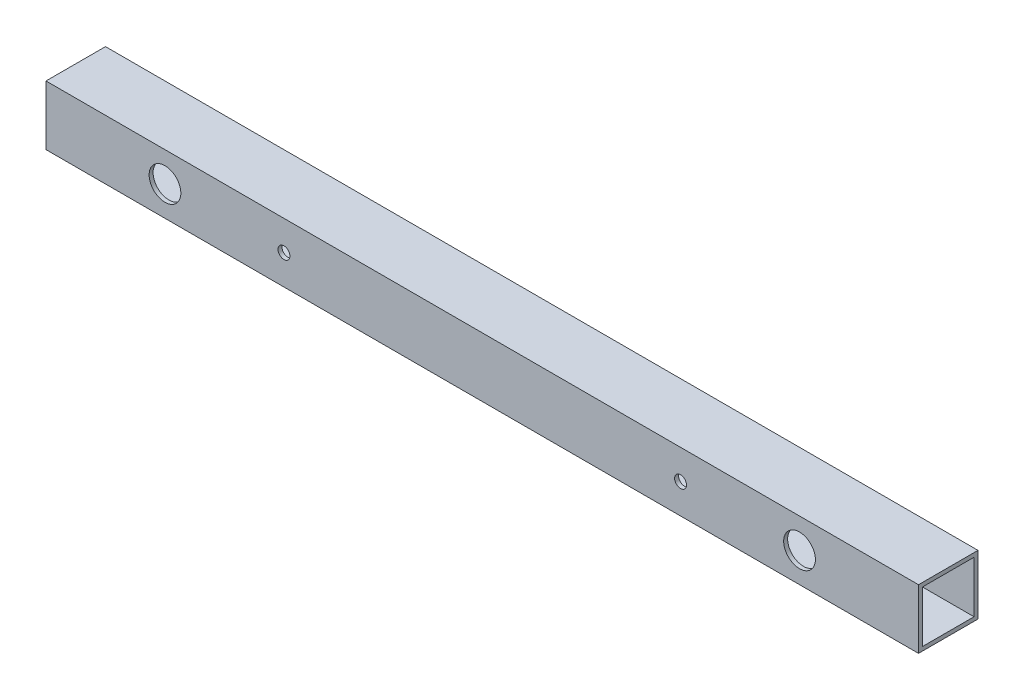
ISO-10303-21;
HEADER;
FILE_DESCRIPTION(('STEP AP214'),'2;1');
FILE_NAME('part.step','',(''),(''),'','','');
FILE_SCHEMA(('AUTOMOTIVE_DESIGN { 1 0 10303 214 1 1 1 1 }'));
ENDSEC;
DATA;
#1=APPLICATION_CONTEXT('core data for automotive mechanical design processes');
#2=APPLICATION_PROTOCOL_DEFINITION('international standard','automotive_design',2000,#1);
#3=PRODUCT_CONTEXT('',#1,'mechanical');
#4=PRODUCT('Part','Part','',(#3));
#5=PRODUCT_RELATED_PRODUCT_CATEGORY('part','',(#4));
#6=PRODUCT_DEFINITION_FORMATION('','',#4);
#7=PRODUCT_DEFINITION_CONTEXT('part definition',#1,'design');
#8=PRODUCT_DEFINITION('design','',#6,#7);
#9=PRODUCT_DEFINITION_SHAPE('','',#8);
#10=(LENGTH_UNIT() NAMED_UNIT(*) SI_UNIT(.MILLI.,.METRE.));
#11=(NAMED_UNIT(*) PLANE_ANGLE_UNIT() SI_UNIT($,.RADIAN.));
#12=(NAMED_UNIT(*) SI_UNIT($,.STERADIAN.) SOLID_ANGLE_UNIT());
#13=UNCERTAINTY_MEASURE_WITH_UNIT(LENGTH_MEASURE(1.E-05),#10,'distance_accuracy_value','');
#14=(GEOMETRIC_REPRESENTATION_CONTEXT(3) GLOBAL_UNCERTAINTY_ASSIGNED_CONTEXT((#13)) GLOBAL_UNIT_ASSIGNED_CONTEXT((#10,
#11,#12)) REPRESENTATION_CONTEXT('',''));
#15=CARTESIAN_POINT('',(0.,0.,0.));
#16=DIRECTION('',(0.,0.,1.));
#17=DIRECTION('',(1.,0.,0.));
#18=AXIS2_PLACEMENT_3D('',#15,#16,#17);
#19=CARTESIAN_POINT('',(220.,0.,0.));
#20=DIRECTION('',(-1.,0.,0.));
#21=DIRECTION('',(0.,0.,1.));
#22=AXIS2_PLACEMENT_3D('',#19,#20,#21);
#23=PLANE('',#22);
#24=DIRECTION('',(0.,1.,0.));
#25=VECTOR('',#24,1.);
#26=CARTESIAN_POINT('',(220.,-7.5,-7.5));
#27=LINE('',#26,#25);
#28=CARTESIAN_POINT('',(220.,-7.5,-7.5));
#29=VERTEX_POINT('',#28);
#30=CARTESIAN_POINT('',(220.,7.5,-7.5));
#31=VERTEX_POINT('',#30);
#32=EDGE_CURVE('E140',#29,#31,#27,.T.);
#33=ORIENTED_EDGE('',*,*,#32,.T.);
#34=DIRECTION('',(0.,0.,1.));
#35=VECTOR('',#34,1.);
#36=CARTESIAN_POINT('',(220.,7.5,7.5));
#37=LINE('',#36,#35);
#38=CARTESIAN_POINT('',(220.,7.5,7.5));
#39=VERTEX_POINT('',#38);
#40=EDGE_CURVE('E143',#31,#39,#37,.T.);
#41=ORIENTED_EDGE('',*,*,#40,.T.);
#42=DIRECTION('',(0.,-1.,0.));
#43=VECTOR('',#42,1.);
#44=CARTESIAN_POINT('',(220.,-7.5,7.5));
#45=LINE('',#44,#43);
#46=CARTESIAN_POINT('',(220.,-7.5,7.5));
#47=VERTEX_POINT('',#46);
#48=EDGE_CURVE('E146',#39,#47,#45,.T.);
#49=ORIENTED_EDGE('',*,*,#48,.T.);
#50=DIRECTION('',(0.,0.,-1.));
#51=VECTOR('',#50,1.);
#52=CARTESIAN_POINT('',(220.,-7.5,7.5));
#53=LINE('',#52,#51);
#54=EDGE_CURVE('E148',#47,#29,#53,.T.);
#55=ORIENTED_EDGE('',*,*,#54,.T.);
#56=EDGE_LOOP('',(#33,#41,#49,#55));
#57=FACE_BOUND('',#56,.T.);
#58=DIRECTION('',(0.,-1.,0.));
#59=VECTOR('',#58,1.);
#60=CARTESIAN_POINT('',(220.,-6.5,6.5));
#61=LINE('',#60,#59);
#62=CARTESIAN_POINT('',(220.,6.5,6.5));
#63=VERTEX_POINT('',#62);
#64=CARTESIAN_POINT('',(220.,-6.5,6.5));
#65=VERTEX_POINT('',#64);
#66=EDGE_CURVE('E102',#63,#65,#61,.T.);
#67=ORIENTED_EDGE('',*,*,#66,.F.);
#68=DIRECTION('',(0.,0.,1.));
#69=VECTOR('',#68,1.);
#70=CARTESIAN_POINT('',(220.,6.5,6.5));
#71=LINE('',#70,#69);
#72=CARTESIAN_POINT('',(220.,6.5,-6.5));
#73=VERTEX_POINT('',#72);
#74=EDGE_CURVE('E124',#73,#63,#71,.T.);
#75=ORIENTED_EDGE('',*,*,#74,.F.);
#76=DIRECTION('',(0.,1.,0.));
#77=VECTOR('',#76,1.);
#78=CARTESIAN_POINT('',(220.,-6.5,-6.5));
#79=LINE('',#78,#77);
#80=CARTESIAN_POINT('',(220.,-6.5,-6.5));
#81=VERTEX_POINT('',#80);
#82=EDGE_CURVE('E122',#81,#73,#79,.T.);
#83=ORIENTED_EDGE('',*,*,#82,.F.);
#84=DIRECTION('',(0.,0.,-1.));
#85=VECTOR('',#84,1.);
#86=CARTESIAN_POINT('',(220.,-6.5,6.5));
#87=LINE('',#86,#85);
#88=EDGE_CURVE('E110',#65,#81,#87,.T.);
#89=ORIENTED_EDGE('',*,*,#88,.F.);
#90=EDGE_LOOP('',(#67,#75,#83,#89));
#91=FACE_BOUND('',#90,.T.);
#92=ADVANCED_FACE('F35',(#57,#91),#23,.F.);
#93=CARTESIAN_POINT('',(0.,0.,0.));
#94=DIRECTION('',(-1.,0.,0.));
#95=DIRECTION('',(0.,0.,1.));
#96=AXIS2_PLACEMENT_3D('',#93,#94,#95);
#97=PLANE('',#96);
#98=DIRECTION('',(0.,1.,0.));
#99=VECTOR('',#98,1.);
#100=CARTESIAN_POINT('',(0.,-7.5,-7.5));
#101=LINE('',#100,#99);
#102=CARTESIAN_POINT('',(0.,-7.5,-7.5));
#103=VERTEX_POINT('',#102);
#104=CARTESIAN_POINT('',(0.,7.5,-7.5));
#105=VERTEX_POINT('',#104);
#106=EDGE_CURVE('E118',#103,#105,#101,.T.);
#107=ORIENTED_EDGE('',*,*,#106,.F.);
#108=DIRECTION('',(0.,0.,-1.));
#109=VECTOR('',#108,1.);
#110=CARTESIAN_POINT('',(0.,-7.5,7.5));
#111=LINE('',#110,#109);
#112=CARTESIAN_POINT('',(0.,-7.5,7.5));
#113=VERTEX_POINT('',#112);
#114=EDGE_CURVE('E144',#113,#103,#111,.T.);
#115=ORIENTED_EDGE('',*,*,#114,.F.);
#116=DIRECTION('',(0.,-1.,0.));
#117=VECTOR('',#116,1.);
#118=CARTESIAN_POINT('',(0.,-7.5,7.5));
#119=LINE('',#118,#117);
#120=CARTESIAN_POINT('',(0.,7.5,7.5));
#121=VERTEX_POINT('',#120);
#122=EDGE_CURVE('E155',#121,#113,#119,.T.);
#123=ORIENTED_EDGE('',*,*,#122,.F.);
#124=DIRECTION('',(0.,0.,1.));
#125=VECTOR('',#124,1.);
#126=CARTESIAN_POINT('',(0.,7.5,7.5));
#127=LINE('',#126,#125);
#128=EDGE_CURVE('E153',#105,#121,#127,.T.);
#129=ORIENTED_EDGE('',*,*,#128,.F.);
#130=EDGE_LOOP('',(#107,#115,#123,#129));
#131=FACE_BOUND('',#130,.T.);
#132=DIRECTION('',(0.,0.,1.));
#133=VECTOR('',#132,1.);
#134=CARTESIAN_POINT('',(0.,6.5,6.5));
#135=LINE('',#134,#133);
#136=CARTESIAN_POINT('',(0.,6.5,-6.5));
#137=VERTEX_POINT('',#136);
#138=CARTESIAN_POINT('',(0.,6.5,6.5));
#139=VERTEX_POINT('',#138);
#140=EDGE_CURVE('E111',#137,#139,#135,.T.);
#141=ORIENTED_EDGE('',*,*,#140,.T.);
#142=DIRECTION('',(0.,-1.,0.));
#143=VECTOR('',#142,1.);
#144=CARTESIAN_POINT('',(0.,-6.5,6.5));
#145=LINE('',#144,#143);
#146=CARTESIAN_POINT('',(0.,-6.5,6.5));
#147=VERTEX_POINT('',#146);
#148=EDGE_CURVE('E60',#139,#147,#145,.T.);
#149=ORIENTED_EDGE('',*,*,#148,.T.);
#150=DIRECTION('',(0.,0.,-1.));
#151=VECTOR('',#150,1.);
#152=CARTESIAN_POINT('',(0.,-6.5,6.5));
#153=LINE('',#152,#151);
#154=CARTESIAN_POINT('',(0.,-6.5,-6.5));
#155=VERTEX_POINT('',#154);
#156=EDGE_CURVE('E117',#147,#155,#153,.T.);
#157=ORIENTED_EDGE('',*,*,#156,.T.);
#158=DIRECTION('',(0.,1.,0.));
#159=VECTOR('',#158,1.);
#160=CARTESIAN_POINT('',(0.,-6.5,-6.5));
#161=LINE('',#160,#159);
#162=EDGE_CURVE('E132',#155,#137,#161,.T.);
#163=ORIENTED_EDGE('',*,*,#162,.T.);
#164=EDGE_LOOP('',(#141,#149,#157,#163));
#165=FACE_BOUND('',#164,.T.);
#166=ADVANCED_FACE('F217',(#131,#165),#97,.T.);
#167=CARTESIAN_POINT('',(220.,-7.5,-7.5));
#168=DIRECTION('',(0.,0.,1.));
#169=DIRECTION('',(1.,0.,0.));
#170=AXIS2_PLACEMENT_3D('',#167,#168,#169);
#171=PLANE('',#170);
#172=CARTESIAN_POINT('',(60.,0.,-7.5));
#173=DIRECTION('',(0.,0.,-1.));
#174=DIRECTION('',(-1.,0.,0.));
#175=AXIS2_PLACEMENT_3D('',#172,#173,#174);
#176=CIRCLE('',#175,4.00000000000001);
#177=CARTESIAN_POINT('',(56.,0.,-7.5));
#178=VERTEX_POINT('',#177);
#179=EDGE_CURVE('E180',#178,#178,#176,.T.);
#180=ORIENTED_EDGE('',*,*,#179,.F.);
#181=EDGE_LOOP('',(#180));
#182=FACE_BOUND('',#181,.T.);
#183=CARTESIAN_POINT('',(160.,0.,-7.5));
#184=DIRECTION('',(0.,0.,-1.));
#185=DIRECTION('',(-1.,0.,0.));
#186=AXIS2_PLACEMENT_3D('',#183,#184,#185);
#187=CIRCLE('',#186,3.99999999999999);
#188=CARTESIAN_POINT('',(156.,0.,-7.5));
#189=VERTEX_POINT('',#188);
#190=EDGE_CURVE('E177',#189,#189,#187,.T.);
#191=ORIENTED_EDGE('',*,*,#190,.F.);
#192=EDGE_LOOP('',(#191));
#193=FACE_BOUND('',#192,.T.);
#194=CARTESIAN_POINT('',(190.,0.,-7.5));
#195=DIRECTION('',(0.,0.,-1.));
#196=DIRECTION('',(1.,0.,0.));
#197=AXIS2_PLACEMENT_3D('',#194,#195,#196);
#198=CIRCLE('',#197,1.5);
#199=CARTESIAN_POINT('',(191.5,0.,-7.5));
#200=VERTEX_POINT('',#199);
#201=EDGE_CURVE('E176',#200,#200,#198,.T.);
#202=ORIENTED_EDGE('',*,*,#201,.F.);
#203=EDGE_LOOP('',(#202));
#204=FACE_BOUND('',#203,.T.);
#205=CARTESIAN_POINT('',(30.,0.,-7.5));
#206=DIRECTION('',(0.,0.,-1.));
#207=DIRECTION('',(-1.,0.,0.));
#208=AXIS2_PLACEMENT_3D('',#205,#206,#207);
#209=CIRCLE('',#208,1.5);
#210=CARTESIAN_POINT('',(28.5,0.,-7.5));
#211=VERTEX_POINT('',#210);
#212=EDGE_CURVE('E167',#211,#211,#209,.T.);
#213=ORIENTED_EDGE('',*,*,#212,.F.);
#214=EDGE_LOOP('',(#213));
#215=FACE_BOUND('',#214,.T.);
#216=ORIENTED_EDGE('',*,*,#106,.T.);
#217=DIRECTION('',(-1.,0.,0.));
#218=VECTOR('',#217,1.);
#219=CARTESIAN_POINT('',(220.,7.5,-7.5));
#220=LINE('',#219,#218);
#221=EDGE_CURVE('E11',#31,#105,#220,.T.);
#222=ORIENTED_EDGE('',*,*,#221,.F.);
#223=ORIENTED_EDGE('',*,*,#32,.F.);
#224=DIRECTION('',(-1.,0.,0.));
#225=VECTOR('',#224,1.);
#226=CARTESIAN_POINT('',(220.,-7.5,-7.5));
#227=LINE('',#226,#225);
#228=EDGE_CURVE('E150',#29,#103,#227,.T.);
#229=ORIENTED_EDGE('',*,*,#228,.T.);
#230=EDGE_LOOP('',(#216,#222,#223,#229));
#231=FACE_BOUND('',#230,.T.);
#232=ADVANCED_FACE('F37',(#182,#193,#204,#215,#231),#171,.F.);
#233=CARTESIAN_POINT('',(220.,7.5,7.5));
#234=DIRECTION('',(0.,-1.,0.));
#235=DIRECTION('',(0.,0.,-1.));
#236=AXIS2_PLACEMENT_3D('',#233,#234,#235);
#237=PLANE('',#236);
#238=ORIENTED_EDGE('',*,*,#128,.T.);
#239=DIRECTION('',(-1.,0.,0.));
#240=VECTOR('',#239,1.);
#241=CARTESIAN_POINT('',(220.,7.5,7.5));
#242=LINE('',#241,#240);
#243=EDGE_CURVE('E44',#39,#121,#242,.T.);
#244=ORIENTED_EDGE('',*,*,#243,.F.);
#245=ORIENTED_EDGE('',*,*,#40,.F.);
#246=ORIENTED_EDGE('',*,*,#221,.T.);
#247=EDGE_LOOP('',(#238,#244,#245,#246));
#248=FACE_BOUND('',#247,.T.);
#249=ADVANCED_FACE('F216',(#248),#237,.F.);
#250=CARTESIAN_POINT('',(220.,-7.5,7.5));
#251=DIRECTION('',(0.,0.,-1.));
#252=DIRECTION('',(-1.,0.,0.));
#253=AXIS2_PLACEMENT_3D('',#250,#251,#252);
#254=PLANE('',#253);
#255=CARTESIAN_POINT('',(30.,0.,7.5));
#256=DIRECTION('',(0.,0.,1.));
#257=DIRECTION('',(1.,0.,0.));
#258=AXIS2_PLACEMENT_3D('',#255,#256,#257);
#259=CIRCLE('',#258,4.00000000000001);
#260=CARTESIAN_POINT('',(34.,0.,7.5));
#261=VERTEX_POINT('',#260);
#262=EDGE_CURVE('E193',#261,#261,#259,.T.);
#263=ORIENTED_EDGE('',*,*,#262,.F.);
#264=EDGE_LOOP('',(#263));
#265=FACE_BOUND('',#264,.T.);
#266=CARTESIAN_POINT('',(190.,0.,7.5));
#267=DIRECTION('',(0.,0.,1.));
#268=DIRECTION('',(1.,0.,0.));
#269=AXIS2_PLACEMENT_3D('',#266,#267,#268);
#270=CIRCLE('',#269,3.99999999999999);
#271=CARTESIAN_POINT('',(194.,0.,7.5));
#272=VERTEX_POINT('',#271);
#273=EDGE_CURVE('E183',#272,#272,#270,.T.);
#274=ORIENTED_EDGE('',*,*,#273,.F.);
#275=EDGE_LOOP('',(#274));
#276=FACE_BOUND('',#275,.T.);
#277=CARTESIAN_POINT('',(60.,0.,7.5));
#278=DIRECTION('',(0.,0.,-1.));
#279=DIRECTION('',(-1.,0.,0.));
#280=AXIS2_PLACEMENT_3D('',#277,#278,#279);
#281=CIRCLE('',#280,1.5);
#282=CARTESIAN_POINT('',(58.5,0.,7.5));
#283=VERTEX_POINT('',#282);
#284=EDGE_CURVE('E172',#283,#283,#281,.T.);
#285=ORIENTED_EDGE('',*,*,#284,.T.);
#286=EDGE_LOOP('',(#285));
#287=FACE_BOUND('',#286,.T.);
#288=CARTESIAN_POINT('',(160.,0.,7.5));
#289=DIRECTION('',(0.,0.,-1.));
#290=DIRECTION('',(1.,0.,0.));
#291=AXIS2_PLACEMENT_3D('',#288,#289,#290);
#292=CIRCLE('',#291,1.5);
#293=CARTESIAN_POINT('',(161.5,0.,7.5));
#294=VERTEX_POINT('',#293);
#295=EDGE_CURVE('E200',#294,#294,#292,.T.);
#296=ORIENTED_EDGE('',*,*,#295,.T.);
#297=EDGE_LOOP('',(#296));
#298=FACE_BOUND('',#297,.T.);
#299=ORIENTED_EDGE('',*,*,#122,.T.);
#300=DIRECTION('',(-1.,0.,0.));
#301=VECTOR('',#300,1.);
#302=CARTESIAN_POINT('',(220.,-7.5,7.5));
#303=LINE('',#302,#301);
#304=EDGE_CURVE('E160',#47,#113,#303,.T.);
#305=ORIENTED_EDGE('',*,*,#304,.F.);
#306=ORIENTED_EDGE('',*,*,#48,.F.);
#307=ORIENTED_EDGE('',*,*,#243,.T.);
#308=EDGE_LOOP('',(#299,#305,#306,#307));
#309=FACE_BOUND('',#308,.T.);
#310=ADVANCED_FACE('F236',(#265,#276,#287,#298,#309),#254,.F.);
#311=CARTESIAN_POINT('',(220.,-7.5,7.5));
#312=DIRECTION('',(0.,1.,0.));
#313=DIRECTION('',(0.,0.,1.));
#314=AXIS2_PLACEMENT_3D('',#311,#312,#313);
#315=PLANE('',#314);
#316=ORIENTED_EDGE('',*,*,#114,.T.);
#317=ORIENTED_EDGE('',*,*,#228,.F.);
#318=ORIENTED_EDGE('',*,*,#54,.F.);
#319=ORIENTED_EDGE('',*,*,#304,.T.);
#320=EDGE_LOOP('',(#316,#317,#318,#319));
#321=FACE_BOUND('',#320,.T.);
#322=ADVANCED_FACE('F234',(#321),#315,.F.);
#323=CARTESIAN_POINT('',(220.,-6.5,6.5));
#324=DIRECTION('',(0.,0.,-1.));
#325=DIRECTION('',(-1.,0.,0.));
#326=AXIS2_PLACEMENT_3D('',#323,#324,#325);
#327=PLANE('',#326);
#328=CARTESIAN_POINT('',(30.,0.,6.5));
#329=DIRECTION('',(0.,0.,-1.));
#330=DIRECTION('',(-1.,0.,0.));
#331=AXIS2_PLACEMENT_3D('',#328,#329,#330);
#332=CIRCLE('',#331,4.00000000000001);
#333=CARTESIAN_POINT('',(26.,0.,6.5));
#334=VERTEX_POINT('',#333);
#335=EDGE_CURVE('E39',#334,#334,#332,.T.);
#336=ORIENTED_EDGE('',*,*,#335,.F.);
#337=EDGE_LOOP('',(#336));
#338=FACE_BOUND('',#337,.T.);
#339=CARTESIAN_POINT('',(190.,0.,6.5));
#340=DIRECTION('',(0.,0.,-1.));
#341=DIRECTION('',(-1.,0.,0.));
#342=AXIS2_PLACEMENT_3D('',#339,#340,#341);
#343=CIRCLE('',#342,3.99999999999999);
#344=CARTESIAN_POINT('',(186.,0.,6.5));
#345=VERTEX_POINT('',#344);
#346=EDGE_CURVE('E181',#345,#345,#343,.T.);
#347=ORIENTED_EDGE('',*,*,#346,.F.);
#348=EDGE_LOOP('',(#347));
#349=FACE_BOUND('',#348,.T.);
#350=CARTESIAN_POINT('',(60.,0.,6.5));
#351=DIRECTION('',(0.,0.,-1.));
#352=DIRECTION('',(-1.,0.,0.));
#353=AXIS2_PLACEMENT_3D('',#350,#351,#352);
#354=CIRCLE('',#353,1.5);
#355=CARTESIAN_POINT('',(58.5,0.,6.5));
#356=VERTEX_POINT('',#355);
#357=EDGE_CURVE('E207',#356,#356,#354,.T.);
#358=ORIENTED_EDGE('',*,*,#357,.F.);
#359=EDGE_LOOP('',(#358));
#360=FACE_BOUND('',#359,.T.);
#361=CARTESIAN_POINT('',(160.,0.,6.5));
#362=DIRECTION('',(0.,0.,-1.));
#363=DIRECTION('',(-1.,0.,0.));
#364=AXIS2_PLACEMENT_3D('',#361,#362,#363);
#365=CIRCLE('',#364,1.5);
#366=CARTESIAN_POINT('',(158.5,0.,6.5));
#367=VERTEX_POINT('',#366);
#368=EDGE_CURVE('E171',#367,#367,#365,.T.);
#369=ORIENTED_EDGE('',*,*,#368,.F.);
#370=EDGE_LOOP('',(#369));
#371=FACE_BOUND('',#370,.T.);
#372=ORIENTED_EDGE('',*,*,#148,.F.);
#373=DIRECTION('',(-1.,0.,0.));
#374=VECTOR('',#373,1.);
#375=CARTESIAN_POINT('',(220.,6.5,6.5));
#376=LINE('',#375,#374);
#377=EDGE_CURVE('E106',#63,#139,#376,.T.);
#378=ORIENTED_EDGE('',*,*,#377,.F.);
#379=ORIENTED_EDGE('',*,*,#66,.T.);
#380=DIRECTION('',(-1.,0.,0.));
#381=VECTOR('',#380,1.);
#382=CARTESIAN_POINT('',(220.,-6.5,6.5));
#383=LINE('',#382,#381);
#384=EDGE_CURVE('E105',#65,#147,#383,.T.);
#385=ORIENTED_EDGE('',*,*,#384,.T.);
#386=EDGE_LOOP('',(#372,#378,#379,#385));
#387=FACE_BOUND('',#386,.T.);
#388=ADVANCED_FACE('F104',(#338,#349,#360,#371,#387),#327,.T.);
#389=CARTESIAN_POINT('',(220.,-6.5,6.5));
#390=DIRECTION('',(0.,1.,0.));
#391=DIRECTION('',(0.,0.,1.));
#392=AXIS2_PLACEMENT_3D('',#389,#390,#391);
#393=PLANE('',#392);
#394=ORIENTED_EDGE('',*,*,#156,.F.);
#395=ORIENTED_EDGE('',*,*,#384,.F.);
#396=ORIENTED_EDGE('',*,*,#88,.T.);
#397=DIRECTION('',(-1.,0.,0.));
#398=VECTOR('',#397,1.);
#399=CARTESIAN_POINT('',(220.,-6.5,-6.5));
#400=LINE('',#399,#398);
#401=EDGE_CURVE('E119',#81,#155,#400,.T.);
#402=ORIENTED_EDGE('',*,*,#401,.T.);
#403=EDGE_LOOP('',(#394,#395,#396,#402));
#404=FACE_BOUND('',#403,.T.);
#405=ADVANCED_FACE('F114',(#404),#393,.T.);
#406=CARTESIAN_POINT('',(220.,-6.5,-6.5));
#407=DIRECTION('',(0.,0.,1.));
#408=DIRECTION('',(0.,-1.,0.));
#409=AXIS2_PLACEMENT_3D('',#406,#407,#408);
#410=PLANE('',#409);
#411=CARTESIAN_POINT('',(60.,0.,-6.5));
#412=DIRECTION('',(0.,0.,1.));
#413=DIRECTION('',(0.,-1.,0.));
#414=AXIS2_PLACEMENT_3D('',#411,#412,#413);
#415=CIRCLE('',#414,4.00000000000001);
#416=CARTESIAN_POINT('',(60.,-4.00000000000001,-6.5));
#417=VERTEX_POINT('',#416);
#418=EDGE_CURVE('E178',#417,#417,#415,.T.);
#419=ORIENTED_EDGE('',*,*,#418,.F.);
#420=EDGE_LOOP('',(#419));
#421=FACE_BOUND('',#420,.T.);
#422=CARTESIAN_POINT('',(160.,0.,-6.5));
#423=DIRECTION('',(0.,0.,1.));
#424=DIRECTION('',(0.,-1.,0.));
#425=AXIS2_PLACEMENT_3D('',#422,#423,#424);
#426=CIRCLE('',#425,3.99999999999999);
#427=CARTESIAN_POINT('',(160.,-3.99999999999999,-6.5));
#428=VERTEX_POINT('',#427);
#429=EDGE_CURVE('E173',#428,#428,#426,.T.);
#430=ORIENTED_EDGE('',*,*,#429,.F.);
#431=EDGE_LOOP('',(#430));
#432=FACE_BOUND('',#431,.T.);
#433=CARTESIAN_POINT('',(190.,0.,-6.5));
#434=DIRECTION('',(0.,0.,1.));
#435=DIRECTION('',(0.,-1.,0.));
#436=AXIS2_PLACEMENT_3D('',#433,#434,#435);
#437=CIRCLE('',#436,1.5);
#438=CARTESIAN_POINT('',(190.,-1.5,-6.5));
#439=VERTEX_POINT('',#438);
#440=EDGE_CURVE('E168',#439,#439,#437,.T.);
#441=ORIENTED_EDGE('',*,*,#440,.F.);
#442=EDGE_LOOP('',(#441));
#443=FACE_BOUND('',#442,.T.);
#444=CARTESIAN_POINT('',(30.,0.,-6.5));
#445=DIRECTION('',(0.,0.,1.));
#446=DIRECTION('',(0.,-1.,0.));
#447=AXIS2_PLACEMENT_3D('',#444,#445,#446);
#448=CIRCLE('',#447,1.5);
#449=CARTESIAN_POINT('',(30.,-1.5,-6.5));
#450=VERTEX_POINT('',#449);
#451=EDGE_CURVE('E130',#450,#450,#448,.T.);
#452=ORIENTED_EDGE('',*,*,#451,.F.);
#453=EDGE_LOOP('',(#452));
#454=FACE_BOUND('',#453,.T.);
#455=ORIENTED_EDGE('',*,*,#162,.F.);
#456=ORIENTED_EDGE('',*,*,#401,.F.);
#457=ORIENTED_EDGE('',*,*,#82,.T.);
#458=DIRECTION('',(-1.,0.,0.));
#459=VECTOR('',#458,1.);
#460=CARTESIAN_POINT('',(220.,6.5,-6.5));
#461=LINE('',#460,#459);
#462=EDGE_CURVE('E52',#73,#137,#461,.T.);
#463=ORIENTED_EDGE('',*,*,#462,.T.);
#464=EDGE_LOOP('',(#455,#456,#457,#463));
#465=FACE_BOUND('',#464,.T.);
#466=ADVANCED_FACE('F259',(#421,#432,#443,#454,#465),#410,.T.);
#467=CARTESIAN_POINT('',(220.,6.5,6.5));
#468=DIRECTION('',(0.,-1.,0.));
#469=DIRECTION('',(0.,0.,-1.));
#470=AXIS2_PLACEMENT_3D('',#467,#468,#469);
#471=PLANE('',#470);
#472=ORIENTED_EDGE('',*,*,#140,.F.);
#473=ORIENTED_EDGE('',*,*,#462,.F.);
#474=ORIENTED_EDGE('',*,*,#74,.T.);
#475=ORIENTED_EDGE('',*,*,#377,.T.);
#476=EDGE_LOOP('',(#472,#473,#474,#475));
#477=FACE_BOUND('',#476,.T.);
#478=ADVANCED_FACE('F262',(#477),#471,.T.);
#479=CARTESIAN_POINT('',(30.,0.,7.5));
#480=DIRECTION('',(0.,0.,-1.));
#481=DIRECTION('',(-1.,0.,0.));
#482=AXIS2_PLACEMENT_3D('',#479,#480,#481);
#483=CYLINDRICAL_SURFACE('',#482,1.5);
#484=ORIENTED_EDGE('',*,*,#451,.T.);
#485=EDGE_LOOP('',(#484));
#486=FACE_BOUND('',#485,.T.);
#487=ORIENTED_EDGE('',*,*,#212,.T.);
#488=EDGE_LOOP('',(#487));
#489=FACE_BOUND('',#488,.T.);
#490=ADVANCED_FACE('F212',(#486,#489),#483,.F.);
#491=CARTESIAN_POINT('',(190.,0.,7.5));
#492=DIRECTION('',(0.,0.,-1.));
#493=DIRECTION('',(-1.,0.,0.));
#494=AXIS2_PLACEMENT_3D('',#491,#492,#493);
#495=CYLINDRICAL_SURFACE('',#494,1.5);
#496=ORIENTED_EDGE('',*,*,#440,.T.);
#497=EDGE_LOOP('',(#496));
#498=FACE_BOUND('',#497,.T.);
#499=ORIENTED_EDGE('',*,*,#201,.T.);
#500=EDGE_LOOP('',(#499));
#501=FACE_BOUND('',#500,.T.);
#502=ADVANCED_FACE('F268',(#498,#501),#495,.F.);
#503=CARTESIAN_POINT('',(160.,0.,7.5));
#504=DIRECTION('',(0.,0.,-1.));
#505=DIRECTION('',(-1.,0.,0.));
#506=AXIS2_PLACEMENT_3D('',#503,#504,#505);
#507=CYLINDRICAL_SURFACE('',#506,1.5);
#508=ORIENTED_EDGE('',*,*,#368,.T.);
#509=EDGE_LOOP('',(#508));
#510=FACE_BOUND('',#509,.T.);
#511=ORIENTED_EDGE('',*,*,#295,.F.);
#512=EDGE_LOOP('',(#511));
#513=FACE_BOUND('',#512,.T.);
#514=ADVANCED_FACE('F272',(#510,#513),#507,.F.);
#515=CARTESIAN_POINT('',(60.,0.,7.5));
#516=DIRECTION('',(0.,0.,-1.));
#517=DIRECTION('',(-1.,0.,0.));
#518=AXIS2_PLACEMENT_3D('',#515,#516,#517);
#519=CYLINDRICAL_SURFACE('',#518,1.5);
#520=ORIENTED_EDGE('',*,*,#357,.T.);
#521=EDGE_LOOP('',(#520));
#522=FACE_BOUND('',#521,.T.);
#523=ORIENTED_EDGE('',*,*,#284,.F.);
#524=EDGE_LOOP('',(#523));
#525=FACE_BOUND('',#524,.T.);
#526=ADVANCED_FACE('F276',(#522,#525),#519,.F.);
#527=CARTESIAN_POINT('',(160.,0.,2.5));
#528=DIRECTION('',(0.,0.,-1.));
#529=DIRECTION('',(-1.,0.,0.));
#530=AXIS2_PLACEMENT_3D('',#527,#528,#529);
#531=CYLINDRICAL_SURFACE('',#530,3.99999999999999);
#532=ORIENTED_EDGE('',*,*,#429,.T.);
#533=EDGE_LOOP('',(#532));
#534=FACE_BOUND('',#533,.T.);
#535=ORIENTED_EDGE('',*,*,#190,.T.);
#536=EDGE_LOOP('',(#535));
#537=FACE_BOUND('',#536,.T.);
#538=ADVANCED_FACE('F280',(#534,#537),#531,.F.);
#539=CARTESIAN_POINT('',(60.,0.,2.5));
#540=DIRECTION('',(0.,0.,-1.));
#541=DIRECTION('',(-1.,0.,0.));
#542=AXIS2_PLACEMENT_3D('',#539,#540,#541);
#543=CYLINDRICAL_SURFACE('',#542,4.00000000000001);
#544=ORIENTED_EDGE('',*,*,#418,.T.);
#545=EDGE_LOOP('',(#544));
#546=FACE_BOUND('',#545,.T.);
#547=ORIENTED_EDGE('',*,*,#179,.T.);
#548=EDGE_LOOP('',(#547));
#549=FACE_BOUND('',#548,.T.);
#550=ADVANCED_FACE('F284',(#546,#549),#543,.F.);
#551=CARTESIAN_POINT('',(190.,0.,-2.5));
#552=DIRECTION('',(0.,0.,1.));
#553=DIRECTION('',(1.,0.,0.));
#554=AXIS2_PLACEMENT_3D('',#551,#552,#553);
#555=CYLINDRICAL_SURFACE('',#554,3.99999999999999);
#556=ORIENTED_EDGE('',*,*,#346,.T.);
#557=EDGE_LOOP('',(#556));
#558=FACE_BOUND('',#557,.T.);
#559=ORIENTED_EDGE('',*,*,#273,.T.);
#560=EDGE_LOOP('',(#559));
#561=FACE_BOUND('',#560,.T.);
#562=ADVANCED_FACE('F288',(#558,#561),#555,.F.);
#563=CARTESIAN_POINT('',(30.,0.,-2.5));
#564=DIRECTION('',(0.,0.,1.));
#565=DIRECTION('',(1.,0.,0.));
#566=AXIS2_PLACEMENT_3D('',#563,#564,#565);
#567=CYLINDRICAL_SURFACE('',#566,4.00000000000001);
#568=ORIENTED_EDGE('',*,*,#335,.T.);
#569=EDGE_LOOP('',(#568));
#570=FACE_BOUND('',#569,.T.);
#571=ORIENTED_EDGE('',*,*,#262,.T.);
#572=EDGE_LOOP('',(#571));
#573=FACE_BOUND('',#572,.T.);
#574=ADVANCED_FACE('F292',(#570,#573),#567,.F.);
#575=CLOSED_SHELL('',(#92,#166,#232,#249,#310,#322,#388,#405,#466,#478,#490,#502,#514,#526,#538,
#550,#562,#574));
#576=MANIFOLD_SOLID_BREP('B2',#575);
#577=ADVANCED_BREP_SHAPE_REPRESENTATION('',(#18,#576),#14);
#578=SHAPE_DEFINITION_REPRESENTATION(#9,#577);
ENDSEC;
END-ISO-10303-21;
